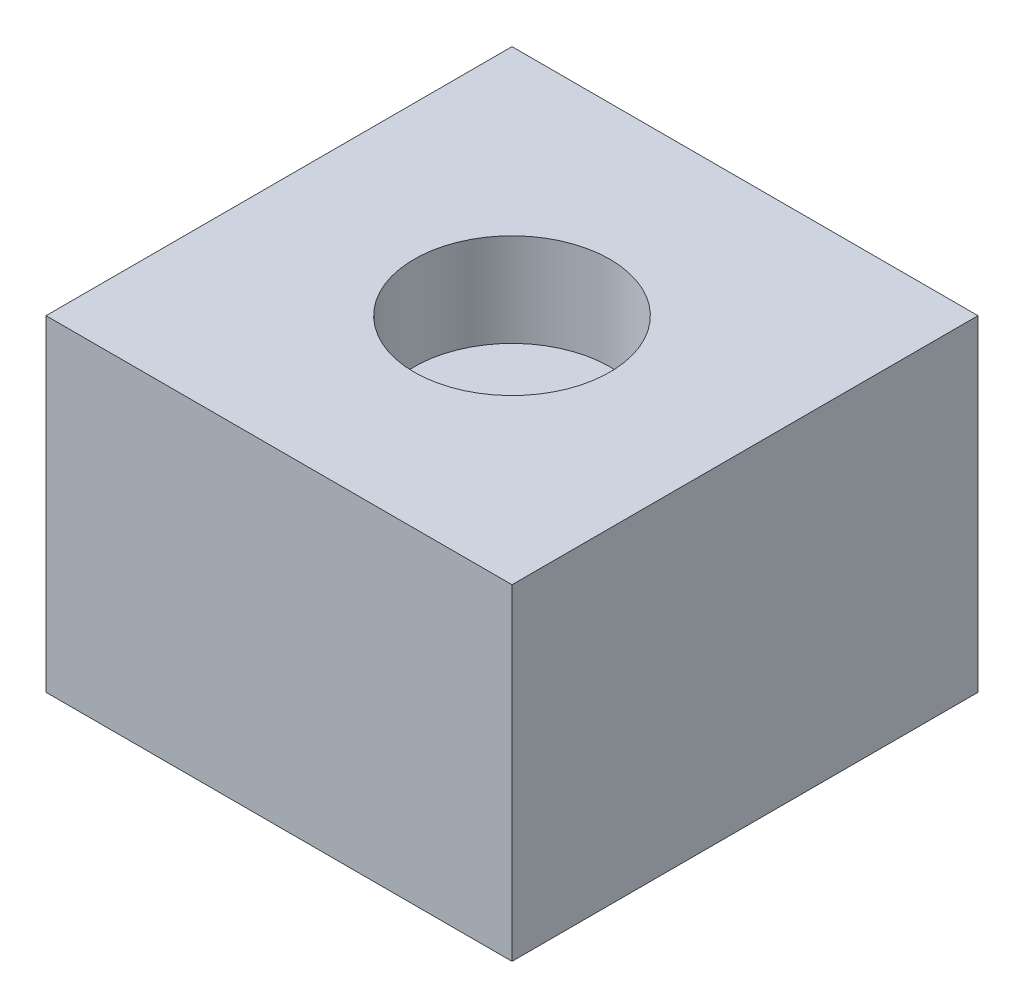
ISO-10303-21;
HEADER;
FILE_DESCRIPTION(('STEP AP214'),'2;1');
FILE_NAME('part.step','',(''),(''),'','','');
FILE_SCHEMA(('AUTOMOTIVE_DESIGN { 1 0 10303 214 1 1 1 1 }'));
ENDSEC;
DATA;
#1=APPLICATION_CONTEXT('core data for automotive mechanical design processes');
#2=APPLICATION_PROTOCOL_DEFINITION('international standard','automotive_design',2000,#1);
#3=PRODUCT_CONTEXT('',#1,'mechanical');
#4=PRODUCT('Part','Part','',(#3));
#5=PRODUCT_RELATED_PRODUCT_CATEGORY('part','',(#4));
#6=PRODUCT_DEFINITION_FORMATION('','',#4);
#7=PRODUCT_DEFINITION_CONTEXT('part definition',#1,'design');
#8=PRODUCT_DEFINITION('design','',#6,#7);
#9=PRODUCT_DEFINITION_SHAPE('','',#8);
#10=(LENGTH_UNIT() NAMED_UNIT(*) SI_UNIT(.MILLI.,.METRE.));
#11=(NAMED_UNIT(*) PLANE_ANGLE_UNIT() SI_UNIT($,.RADIAN.));
#12=(NAMED_UNIT(*) SI_UNIT($,.STERADIAN.) SOLID_ANGLE_UNIT());
#13=UNCERTAINTY_MEASURE_WITH_UNIT(LENGTH_MEASURE(1.E-05),#10,'distance_accuracy_value','');
#14=(GEOMETRIC_REPRESENTATION_CONTEXT(3) GLOBAL_UNCERTAINTY_ASSIGNED_CONTEXT((#13)) GLOBAL_UNIT_ASSIGNED_CONTEXT((#10,
#11,#12)) REPRESENTATION_CONTEXT('',''));
#15=CARTESIAN_POINT('',(0.,0.,0.));
#16=DIRECTION('',(0.,0.,1.));
#17=DIRECTION('',(1.,0.,0.));
#18=AXIS2_PLACEMENT_3D('',#15,#16,#17);
#19=CARTESIAN_POINT('',(0.,7.,0.));
#20=DIRECTION('',(1.,0.,0.));
#21=DIRECTION('',(0.,0.,-1.));
#22=AXIS2_PLACEMENT_3D('',#19,#20,#21);
#23=PLANE('',#22);
#24=DIRECTION('',(0.,0.,1.));
#25=VECTOR('',#24,1.);
#26=CARTESIAN_POINT('',(0.,0.,0.));
#27=LINE('',#26,#25);
#28=CARTESIAN_POINT('',(0.,0.,-10.));
#29=VERTEX_POINT('',#28);
#30=CARTESIAN_POINT('',(0.,0.,0.));
#31=VERTEX_POINT('',#30);
#32=EDGE_CURVE('E102',#29,#31,#27,.T.);
#33=ORIENTED_EDGE('',*,*,#32,.T.);
#34=DIRECTION('',(0.,-1.,0.));
#35=VECTOR('',#34,1.);
#36=CARTESIAN_POINT('',(0.,7.,0.));
#37=LINE('',#36,#35);
#38=CARTESIAN_POINT('',(0.,7.,0.));
#39=VERTEX_POINT('',#38);
#40=EDGE_CURVE('E11',#39,#31,#37,.T.);
#41=ORIENTED_EDGE('',*,*,#40,.F.);
#42=DIRECTION('',(0.,0.,1.));
#43=VECTOR('',#42,1.);
#44=CARTESIAN_POINT('',(0.,7.,0.));
#45=LINE('',#44,#43);
#46=CARTESIAN_POINT('',(0.,7.,-10.));
#47=VERTEX_POINT('',#46);
#48=EDGE_CURVE('E90',#47,#39,#45,.T.);
#49=ORIENTED_EDGE('',*,*,#48,.F.);
#50=DIRECTION('',(0.,-1.,0.));
#51=VECTOR('',#50,1.);
#52=CARTESIAN_POINT('',(0.,7.,-10.));
#53=LINE('',#52,#51);
#54=EDGE_CURVE('E98',#47,#29,#53,.T.);
#55=ORIENTED_EDGE('',*,*,#54,.T.);
#56=EDGE_LOOP('',(#33,#41,#49,#55));
#57=FACE_BOUND('',#56,.T.);
#58=ADVANCED_FACE('F39',(#57),#23,.F.);
#59=CARTESIAN_POINT('',(0.,7.,0.));
#60=DIRECTION('',(0.,0.,-1.));
#61=DIRECTION('',(-1.,0.,0.));
#62=AXIS2_PLACEMENT_3D('',#59,#60,#61);
#63=PLANE('',#62);
#64=DIRECTION('',(1.,0.,0.));
#65=VECTOR('',#64,1.);
#66=CARTESIAN_POINT('',(0.,0.,0.));
#67=LINE('',#66,#65);
#68=CARTESIAN_POINT('',(10.,0.,0.));
#69=VERTEX_POINT('',#68);
#70=EDGE_CURVE('E94',#31,#69,#67,.T.);
#71=ORIENTED_EDGE('',*,*,#70,.T.);
#72=DIRECTION('',(0.,-1.,0.));
#73=VECTOR('',#72,1.);
#74=CARTESIAN_POINT('',(10.,7.,0.));
#75=LINE('',#74,#73);
#76=CARTESIAN_POINT('',(10.,7.,0.));
#77=VERTEX_POINT('',#76);
#78=EDGE_CURVE('E47',#77,#69,#75,.T.);
#79=ORIENTED_EDGE('',*,*,#78,.F.);
#80=DIRECTION('',(1.,0.,0.));
#81=VECTOR('',#80,1.);
#82=CARTESIAN_POINT('',(0.,7.,0.));
#83=LINE('',#82,#81);
#84=EDGE_CURVE('E85',#39,#77,#83,.T.);
#85=ORIENTED_EDGE('',*,*,#84,.F.);
#86=ORIENTED_EDGE('',*,*,#40,.T.);
#87=EDGE_LOOP('',(#71,#79,#85,#86));
#88=FACE_BOUND('',#87,.T.);
#89=ADVANCED_FACE('F93',(#88),#63,.F.);
#90=CARTESIAN_POINT('',(10.,7.,0.));
#91=DIRECTION('',(-1.,0.,0.));
#92=DIRECTION('',(0.,0.,1.));
#93=AXIS2_PLACEMENT_3D('',#90,#91,#92);
#94=PLANE('',#93);
#95=DIRECTION('',(0.,0.,-1.));
#96=VECTOR('',#95,1.);
#97=CARTESIAN_POINT('',(10.,0.,0.));
#98=LINE('',#97,#96);
#99=CARTESIAN_POINT('',(10.,0.,-10.));
#100=VERTEX_POINT('',#99);
#101=EDGE_CURVE('E72',#69,#100,#98,.T.);
#102=ORIENTED_EDGE('',*,*,#101,.T.);
#103=DIRECTION('',(0.,-1.,0.));
#104=VECTOR('',#103,1.);
#105=CARTESIAN_POINT('',(10.,7.,-10.));
#106=LINE('',#105,#104);
#107=CARTESIAN_POINT('',(10.,7.,-10.));
#108=VERTEX_POINT('',#107);
#109=EDGE_CURVE('E95',#108,#100,#106,.T.);
#110=ORIENTED_EDGE('',*,*,#109,.F.);
#111=DIRECTION('',(0.,0.,-1.));
#112=VECTOR('',#111,1.);
#113=CARTESIAN_POINT('',(10.,7.,0.));
#114=LINE('',#113,#112);
#115=EDGE_CURVE('E88',#77,#108,#114,.T.);
#116=ORIENTED_EDGE('',*,*,#115,.F.);
#117=ORIENTED_EDGE('',*,*,#78,.T.);
#118=EDGE_LOOP('',(#102,#110,#116,#117));
#119=FACE_BOUND('',#118,.T.);
#120=ADVANCED_FACE('F96',(#119),#94,.F.);
#121=CARTESIAN_POINT('',(0.,7.,-10.));
#122=DIRECTION('',(0.,0.,1.));
#123=DIRECTION('',(1.,0.,0.));
#124=AXIS2_PLACEMENT_3D('',#121,#122,#123);
#125=PLANE('',#124);
#126=DIRECTION('',(-1.,0.,0.));
#127=VECTOR('',#126,1.);
#128=CARTESIAN_POINT('',(0.,0.,-10.));
#129=LINE('',#128,#127);
#130=EDGE_CURVE('E78',#100,#29,#129,.T.);
#131=ORIENTED_EDGE('',*,*,#130,.T.);
#132=ORIENTED_EDGE('',*,*,#54,.F.);
#133=DIRECTION('',(-1.,0.,0.));
#134=VECTOR('',#133,1.);
#135=CARTESIAN_POINT('',(0.,7.,-10.));
#136=LINE('',#135,#134);
#137=EDGE_CURVE('E55',#108,#47,#136,.T.);
#138=ORIENTED_EDGE('',*,*,#137,.F.);
#139=ORIENTED_EDGE('',*,*,#109,.T.);
#140=EDGE_LOOP('',(#131,#132,#138,#139));
#141=FACE_BOUND('',#140,.T.);
#142=ADVANCED_FACE('F110',(#141),#125,.F.);
#143=CARTESIAN_POINT('',(0.,7.,0.));
#144=DIRECTION('',(0.,-1.,0.));
#145=DIRECTION('',(0.,0.,-1.));
#146=AXIS2_PLACEMENT_3D('',#143,#144,#145);
#147=PLANE('',#146);
#148=CARTESIAN_POINT('',(5.,7.,-5.));
#149=DIRECTION('',(0.,1.,0.));
#150=DIRECTION('',(0.,0.,1.));
#151=AXIS2_PLACEMENT_3D('',#148,#149,#150);
#152=CIRCLE('',#151,2.1);
#153=CARTESIAN_POINT('',(5.,7.,-2.9));
#154=VERTEX_POINT('',#153);
#155=EDGE_CURVE('E116',#154,#154,#152,.T.);
#156=ORIENTED_EDGE('',*,*,#155,.F.);
#157=EDGE_LOOP('',(#156));
#158=FACE_BOUND('',#157,.T.);
#159=ORIENTED_EDGE('',*,*,#48,.T.);
#160=ORIENTED_EDGE('',*,*,#84,.T.);
#161=ORIENTED_EDGE('',*,*,#115,.T.);
#162=ORIENTED_EDGE('',*,*,#137,.T.);
#163=EDGE_LOOP('',(#159,#160,#161,#162));
#164=FACE_BOUND('',#163,.T.);
#165=ADVANCED_FACE('F86',(#158,#164),#147,.F.);
#166=CARTESIAN_POINT('',(0.,0.,0.));
#167=DIRECTION('',(0.,-1.,0.));
#168=DIRECTION('',(0.,0.,-1.));
#169=AXIS2_PLACEMENT_3D('',#166,#167,#168);
#170=PLANE('',#169);
#171=ORIENTED_EDGE('',*,*,#32,.F.);
#172=ORIENTED_EDGE('',*,*,#130,.F.);
#173=ORIENTED_EDGE('',*,*,#101,.F.);
#174=ORIENTED_EDGE('',*,*,#70,.F.);
#175=EDGE_LOOP('',(#171,#172,#173,#174));
#176=FACE_BOUND('',#175,.T.);
#177=ADVANCED_FACE('F113',(#176),#170,.T.);
#178=CARTESIAN_POINT('',(5.,5.,-5.));
#179=DIRECTION('',(0.,1.,0.));
#180=DIRECTION('',(0.,0.,1.));
#181=AXIS2_PLACEMENT_3D('',#178,#179,#180);
#182=CYLINDRICAL_SURFACE('',#181,2.1);
#183=CARTESIAN_POINT('',(5.,5.,-5.));
#184=DIRECTION('',(0.,1.,0.));
#185=DIRECTION('',(0.,0.,1.));
#186=AXIS2_PLACEMENT_3D('',#183,#184,#185);
#187=CIRCLE('',#186,2.1);
#188=CARTESIAN_POINT('',(5.,5.,-2.9));
#189=VERTEX_POINT('',#188);
#190=EDGE_CURVE('E105',#189,#189,#187,.T.);
#191=ORIENTED_EDGE('',*,*,#190,.F.);
#192=EDGE_LOOP('',(#191));
#193=FACE_BOUND('',#192,.T.);
#194=ORIENTED_EDGE('',*,*,#155,.T.);
#195=EDGE_LOOP('',(#194));
#196=FACE_BOUND('',#195,.T.);
#197=ADVANCED_FACE('F124',(#193,#196),#182,.F.);
#198=CARTESIAN_POINT('',(5.,5.,-5.));
#199=DIRECTION('',(0.,1.,0.));
#200=DIRECTION('',(0.,0.,1.));
#201=AXIS2_PLACEMENT_3D('',#198,#199,#200);
#202=PLANE('',#201);
#203=ORIENTED_EDGE('',*,*,#190,.T.);
#204=EDGE_LOOP('',(#203));
#205=FACE_BOUND('',#204,.T.);
#206=ADVANCED_FACE('F122',(#205),#202,.T.);
#207=CLOSED_SHELL('',(#58,#89,#120,#142,#165,#177,#197,#206));
#208=MANIFOLD_SOLID_BREP('B2',#207);
#209=ADVANCED_BREP_SHAPE_REPRESENTATION('',(#18,#208),#14);
#210=SHAPE_DEFINITION_REPRESENTATION(#9,#209);
ENDSEC;
END-ISO-10303-21;
